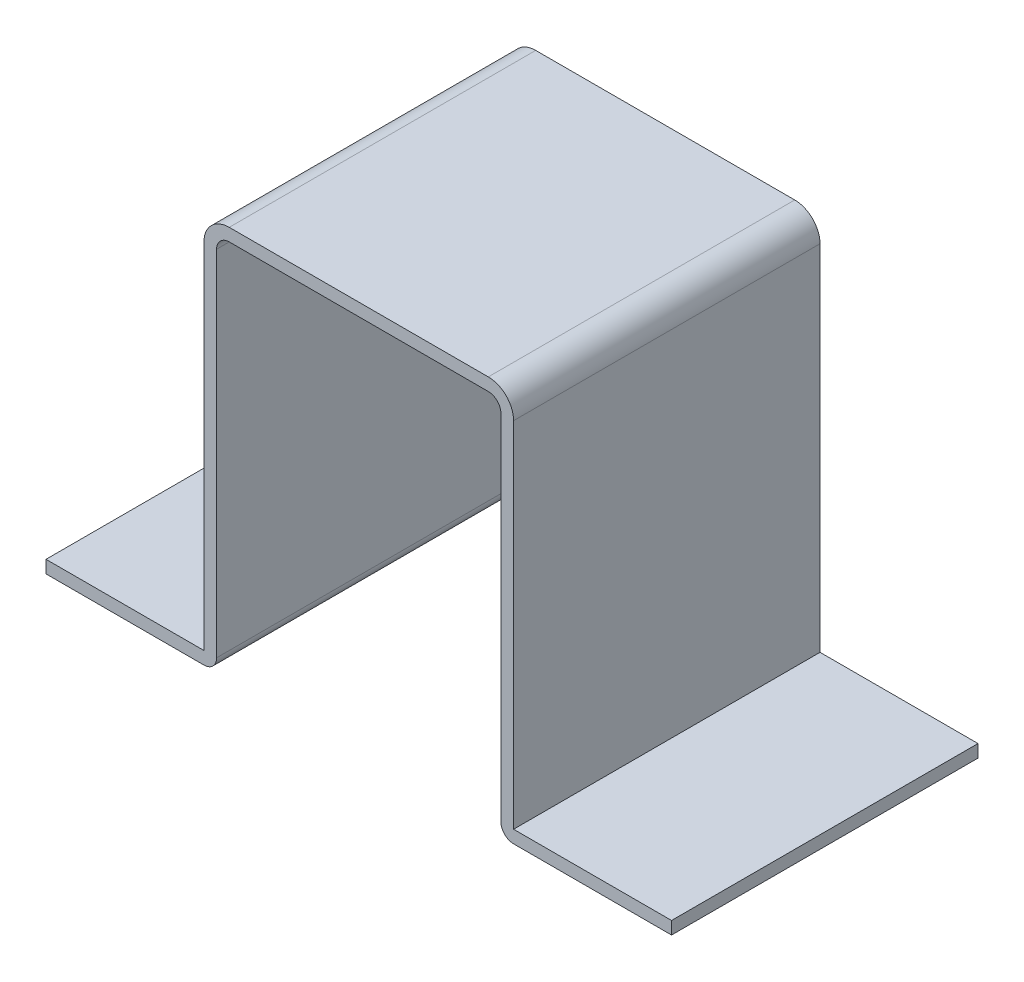
ISO-10303-21;
HEADER;
FILE_DESCRIPTION(('STEP AP214'),'2;1');
FILE_NAME('part.step','',(''),(''),'','','');
FILE_SCHEMA(('AUTOMOTIVE_DESIGN { 1 0 10303 214 1 1 1 1 }'));
ENDSEC;
DATA;
#1=APPLICATION_CONTEXT('core data for automotive mechanical design processes');
#2=APPLICATION_PROTOCOL_DEFINITION('international standard','automotive_design',2000,#1);
#3=PRODUCT_CONTEXT('',#1,'mechanical');
#4=PRODUCT('Part','Part','',(#3));
#5=PRODUCT_RELATED_PRODUCT_CATEGORY('part','',(#4));
#6=PRODUCT_DEFINITION_FORMATION('','',#4);
#7=PRODUCT_DEFINITION_CONTEXT('part definition',#1,'design');
#8=PRODUCT_DEFINITION('design','',#6,#7);
#9=PRODUCT_DEFINITION_SHAPE('','',#8);
#10=(LENGTH_UNIT() NAMED_UNIT(*) SI_UNIT(.MILLI.,.METRE.));
#11=(NAMED_UNIT(*) PLANE_ANGLE_UNIT() SI_UNIT($,.RADIAN.));
#12=(NAMED_UNIT(*) SI_UNIT($,.STERADIAN.) SOLID_ANGLE_UNIT());
#13=UNCERTAINTY_MEASURE_WITH_UNIT(LENGTH_MEASURE(1.E-05),#10,'distance_accuracy_value','');
#14=(GEOMETRIC_REPRESENTATION_CONTEXT(3) GLOBAL_UNCERTAINTY_ASSIGNED_CONTEXT((#13)) GLOBAL_UNIT_ASSIGNED_CONTEXT((#10,
#11,#12)) REPRESENTATION_CONTEXT('',''));
#15=CARTESIAN_POINT('',(0.,0.,0.));
#16=DIRECTION('',(0.,0.,1.));
#17=DIRECTION('',(1.,0.,0.));
#18=AXIS2_PLACEMENT_3D('',#15,#16,#17);
#19=CARTESIAN_POINT('',(24.5,-28.,24.25));
#20=DIRECTION('',(0.,0.,-1.));
#21=DIRECTION('',(-1.,0.,0.));
#22=AXIS2_PLACEMENT_3D('',#19,#20,#21);
#23=CYLINDRICAL_SURFACE('',#22,2.);
#24=CARTESIAN_POINT('',(24.5,-28.,-24.25));
#25=DIRECTION('',(0.,0.,1.));
#26=DIRECTION('',(-1.,0.,0.));
#27=AXIS2_PLACEMENT_3D('',#24,#25,#26);
#28=CIRCLE('',#27,2.);
#29=CARTESIAN_POINT('',(22.5,-28.,-24.25));
#30=VERTEX_POINT('',#29);
#31=CARTESIAN_POINT('',(24.5,-30.,-24.25));
#32=VERTEX_POINT('',#31);
#33=EDGE_CURVE('E190',#30,#32,#28,.T.);
#34=ORIENTED_EDGE('',*,*,#33,.T.);
#35=DIRECTION('',(0.,0.,-1.));
#36=VECTOR('',#35,1.);
#37=CARTESIAN_POINT('',(24.5,-30.,24.25));
#38=LINE('',#37,#36);
#39=CARTESIAN_POINT('',(24.5,-30.,24.25));
#40=VERTEX_POINT('',#39);
#41=EDGE_CURVE('E11',#40,#32,#38,.T.);
#42=ORIENTED_EDGE('',*,*,#41,.F.);
#43=CARTESIAN_POINT('',(24.5,-28.,24.25));
#44=DIRECTION('',(0.,0.,1.));
#45=DIRECTION('',(-1.,0.,0.));
#46=AXIS2_PLACEMENT_3D('',#43,#44,#45);
#47=CIRCLE('',#46,2.);
#48=CARTESIAN_POINT('',(22.5,-28.,24.25));
#49=VERTEX_POINT('',#48);
#50=EDGE_CURVE('E224',#49,#40,#47,.T.);
#51=ORIENTED_EDGE('',*,*,#50,.F.);
#52=DIRECTION('',(0.,0.,-1.));
#53=VECTOR('',#52,1.);
#54=CARTESIAN_POINT('',(22.5,-28.,24.25));
#55=LINE('',#54,#53);
#56=EDGE_CURVE('E186',#49,#30,#55,.T.);
#57=ORIENTED_EDGE('',*,*,#56,.T.);
#58=EDGE_LOOP('',(#34,#42,#51,#57));
#59=FACE_BOUND('',#58,.T.);
#60=ADVANCED_FACE('F34',(#59),#23,.T.);
#61=CARTESIAN_POINT('',(24.5,-30.,24.25));
#62=DIRECTION('',(0.,1.,0.));
#63=DIRECTION('',(-1.,0.,0.));
#64=AXIS2_PLACEMENT_3D('',#61,#62,#63);
#65=PLANE('',#64);
#66=DIRECTION('',(1.,0.,0.));
#67=VECTOR('',#66,1.);
#68=CARTESIAN_POINT('',(24.5,-30.,-24.25));
#69=LINE('',#68,#67);
#70=CARTESIAN_POINT('',(49.5,-30.,-24.25));
#71=VERTEX_POINT('',#70);
#72=EDGE_CURVE('E193',#32,#71,#69,.T.);
#73=ORIENTED_EDGE('',*,*,#72,.T.);
#74=DIRECTION('',(0.,0.,-1.));
#75=VECTOR('',#74,1.);
#76=CARTESIAN_POINT('',(49.5,-30.,24.25));
#77=LINE('',#76,#75);
#78=CARTESIAN_POINT('',(49.5,-30.,24.25));
#79=VERTEX_POINT('',#78);
#80=EDGE_CURVE('E42',#79,#71,#77,.T.);
#81=ORIENTED_EDGE('',*,*,#80,.F.);
#82=DIRECTION('',(1.,0.,0.));
#83=VECTOR('',#82,1.);
#84=CARTESIAN_POINT('',(24.5,-30.,24.25));
#85=LINE('',#84,#83);
#86=EDGE_CURVE('E123',#40,#79,#85,.T.);
#87=ORIENTED_EDGE('',*,*,#86,.F.);
#88=ORIENTED_EDGE('',*,*,#41,.T.);
#89=EDGE_LOOP('',(#73,#81,#87,#88));
#90=FACE_BOUND('',#89,.T.);
#91=ADVANCED_FACE('F332',(#90),#65,.F.);
#92=CARTESIAN_POINT('',(49.5,-28.,24.25));
#93=DIRECTION('',(-1.,0.,0.));
#94=DIRECTION('',(0.,0.,1.));
#95=AXIS2_PLACEMENT_3D('',#92,#93,#94);
#96=PLANE('',#95);
#97=DIRECTION('',(0.,1.,0.));
#98=VECTOR('',#97,1.);
#99=CARTESIAN_POINT('',(49.5,-28.,-24.25));
#100=LINE('',#99,#98);
#101=CARTESIAN_POINT('',(49.5,-28.,-24.25));
#102=VERTEX_POINT('',#101);
#103=EDGE_CURVE('E195',#71,#102,#100,.T.);
#104=ORIENTED_EDGE('',*,*,#103,.T.);
#105=DIRECTION('',(0.,0.,-1.));
#106=VECTOR('',#105,1.);
#107=CARTESIAN_POINT('',(49.5,-28.,24.25));
#108=LINE('',#107,#106);
#109=CARTESIAN_POINT('',(49.5,-28.,24.25));
#110=VERTEX_POINT('',#109);
#111=EDGE_CURVE('E261',#110,#102,#108,.T.);
#112=ORIENTED_EDGE('',*,*,#111,.F.);
#113=DIRECTION('',(0.,1.,0.));
#114=VECTOR('',#113,1.);
#115=CARTESIAN_POINT('',(49.5,-28.,24.25));
#116=LINE('',#115,#114);
#117=EDGE_CURVE('E269',#79,#110,#116,.T.);
#118=ORIENTED_EDGE('',*,*,#117,.F.);
#119=ORIENTED_EDGE('',*,*,#80,.T.);
#120=EDGE_LOOP('',(#104,#112,#118,#119));
#121=FACE_BOUND('',#120,.T.);
#122=ADVANCED_FACE('F267',(#121),#96,.F.);
#123=CARTESIAN_POINT('',(24.5,-28.,24.25));
#124=DIRECTION('',(0.,-1.,0.));
#125=DIRECTION('',(0.,0.,-1.));
#126=AXIS2_PLACEMENT_3D('',#123,#124,#125);
#127=PLANE('',#126);
#128=DIRECTION('',(-1.,0.,0.));
#129=VECTOR('',#128,1.);
#130=CARTESIAN_POINT('',(24.5,-28.,-24.25));
#131=LINE('',#130,#129);
#132=CARTESIAN_POINT('',(24.5,-28.,-24.25));
#133=VERTEX_POINT('',#132);
#134=EDGE_CURVE('E197',#102,#133,#131,.T.);
#135=ORIENTED_EDGE('',*,*,#134,.T.);
#136=DIRECTION('',(0.,0.,-1.));
#137=VECTOR('',#136,1.);
#138=CARTESIAN_POINT('',(24.5,-28.,24.25));
#139=LINE('',#138,#137);
#140=CARTESIAN_POINT('',(24.5,-28.,24.25));
#141=VERTEX_POINT('',#140);
#142=EDGE_CURVE('E258',#141,#133,#139,.T.);
#143=ORIENTED_EDGE('',*,*,#142,.F.);
#144=DIRECTION('',(-1.,0.,0.));
#145=VECTOR('',#144,1.);
#146=CARTESIAN_POINT('',(24.5,-28.,24.25));
#147=LINE('',#146,#145);
#148=EDGE_CURVE('E287',#110,#141,#147,.T.);
#149=ORIENTED_EDGE('',*,*,#148,.F.);
#150=ORIENTED_EDGE('',*,*,#111,.T.);
#151=EDGE_LOOP('',(#135,#143,#149,#150));
#152=FACE_BOUND('',#151,.T.);
#153=ADVANCED_FACE('F278',(#152),#127,.F.);
#154=CARTESIAN_POINT('',(24.5,-28.,24.25));
#155=DIRECTION('',(-1.,0.,0.));
#156=DIRECTION('',(0.,-1.,0.));
#157=AXIS2_PLACEMENT_3D('',#154,#155,#156);
#158=PLANE('',#157);
#159=DIRECTION('',(0.,1.,0.));
#160=VECTOR('',#159,1.);
#161=CARTESIAN_POINT('',(24.5,-28.,-24.25));
#162=LINE('',#161,#160);
#163=CARTESIAN_POINT('',(24.5,28.,-24.25));
#164=VERTEX_POINT('',#163);
#165=EDGE_CURVE('E199',#133,#164,#162,.T.);
#166=ORIENTED_EDGE('',*,*,#165,.T.);
#167=DIRECTION('',(0.,0.,-1.));
#168=VECTOR('',#167,1.);
#169=CARTESIAN_POINT('',(24.5,28.,24.25));
#170=LINE('',#169,#168);
#171=CARTESIAN_POINT('',(24.5,28.,24.25));
#172=VERTEX_POINT('',#171);
#173=EDGE_CURVE('E255',#172,#164,#170,.T.);
#174=ORIENTED_EDGE('',*,*,#173,.F.);
#175=DIRECTION('',(0.,1.,0.));
#176=VECTOR('',#175,1.);
#177=CARTESIAN_POINT('',(24.5,-28.,24.25));
#178=LINE('',#177,#176);
#179=EDGE_CURVE('E284',#141,#172,#178,.T.);
#180=ORIENTED_EDGE('',*,*,#179,.F.);
#181=ORIENTED_EDGE('',*,*,#142,.T.);
#182=EDGE_LOOP('',(#166,#174,#180,#181));
#183=FACE_BOUND('',#182,.T.);
#184=ADVANCED_FACE('F282',(#183),#158,.F.);
#185=CARTESIAN_POINT('',(20.5,28.,24.25));
#186=DIRECTION('',(0.,0.,-1.));
#187=DIRECTION('',(-1.,0.,0.));
#188=AXIS2_PLACEMENT_3D('',#185,#186,#187);
#189=CYLINDRICAL_SURFACE('',#188,4.);
#190=CARTESIAN_POINT('',(20.5,28.,-24.25));
#191=DIRECTION('',(0.,0.,1.));
#192=DIRECTION('',(1.,0.,0.));
#193=AXIS2_PLACEMENT_3D('',#190,#191,#192);
#194=CIRCLE('',#193,4.);
#195=CARTESIAN_POINT('',(20.5,32.,-24.25));
#196=VERTEX_POINT('',#195);
#197=EDGE_CURVE('E201',#164,#196,#194,.T.);
#198=ORIENTED_EDGE('',*,*,#197,.T.);
#199=DIRECTION('',(0.,0.,-1.));
#200=VECTOR('',#199,1.);
#201=CARTESIAN_POINT('',(20.5,32.,24.25));
#202=LINE('',#201,#200);
#203=CARTESIAN_POINT('',(20.5,32.,24.25));
#204=VERTEX_POINT('',#203);
#205=EDGE_CURVE('E252',#204,#196,#202,.T.);
#206=ORIENTED_EDGE('',*,*,#205,.F.);
#207=CARTESIAN_POINT('',(20.5,28.,24.25));
#208=DIRECTION('',(0.,0.,1.));
#209=DIRECTION('',(1.,0.,0.));
#210=AXIS2_PLACEMENT_3D('',#207,#208,#209);
#211=CIRCLE('',#210,4.);
#212=EDGE_CURVE('E286',#172,#204,#211,.T.);
#213=ORIENTED_EDGE('',*,*,#212,.F.);
#214=ORIENTED_EDGE('',*,*,#173,.T.);
#215=EDGE_LOOP('',(#198,#206,#213,#214));
#216=FACE_BOUND('',#215,.T.);
#217=ADVANCED_FACE('F345',(#216),#189,.T.);
#218=CARTESIAN_POINT('',(20.5,32.,24.25));
#219=DIRECTION('',(0.,-1.,0.));
#220=DIRECTION('',(0.,0.,-1.));
#221=AXIS2_PLACEMENT_3D('',#218,#219,#220);
#222=PLANE('',#221);
#223=DIRECTION('',(-1.,0.,0.));
#224=VECTOR('',#223,1.);
#225=CARTESIAN_POINT('',(20.5,32.,-24.25));
#226=LINE('',#225,#224);
#227=CARTESIAN_POINT('',(-20.5,32.,-24.25));
#228=VERTEX_POINT('',#227);
#229=EDGE_CURVE('E203',#196,#228,#226,.T.);
#230=ORIENTED_EDGE('',*,*,#229,.T.);
#231=DIRECTION('',(0.,0.,-1.));
#232=VECTOR('',#231,1.);
#233=CARTESIAN_POINT('',(-20.5,32.,24.25));
#234=LINE('',#233,#232);
#235=CARTESIAN_POINT('',(-20.5,32.,24.25));
#236=VERTEX_POINT('',#235);
#237=EDGE_CURVE('E249',#236,#228,#234,.T.);
#238=ORIENTED_EDGE('',*,*,#237,.F.);
#239=DIRECTION('',(-1.,0.,0.));
#240=VECTOR('',#239,1.);
#241=CARTESIAN_POINT('',(20.5,32.,24.25));
#242=LINE('',#241,#240);
#243=EDGE_CURVE('E289',#204,#236,#242,.T.);
#244=ORIENTED_EDGE('',*,*,#243,.F.);
#245=ORIENTED_EDGE('',*,*,#205,.T.);
#246=EDGE_LOOP('',(#230,#238,#244,#245));
#247=FACE_BOUND('',#246,.T.);
#248=ADVANCED_FACE('F348',(#247),#222,.F.);
#249=CARTESIAN_POINT('',(-20.5,28.,24.25));
#250=DIRECTION('',(0.,0.,-1.));
#251=DIRECTION('',(-1.,0.,0.));
#252=AXIS2_PLACEMENT_3D('',#249,#250,#251);
#253=CYLINDRICAL_SURFACE('',#252,4.);
#254=CARTESIAN_POINT('',(-20.5,28.,-24.25));
#255=DIRECTION('',(0.,0.,1.));
#256=DIRECTION('',(1.,0.,0.));
#257=AXIS2_PLACEMENT_3D('',#254,#255,#256);
#258=CIRCLE('',#257,4.);
#259=CARTESIAN_POINT('',(-24.5,28.,-24.25));
#260=VERTEX_POINT('',#259);
#261=EDGE_CURVE('E205',#228,#260,#258,.T.);
#262=ORIENTED_EDGE('',*,*,#261,.T.);
#263=DIRECTION('',(0.,0.,-1.));
#264=VECTOR('',#263,1.);
#265=CARTESIAN_POINT('',(-24.5,28.,24.25));
#266=LINE('',#265,#264);
#267=CARTESIAN_POINT('',(-24.5,28.,24.25));
#268=VERTEX_POINT('',#267);
#269=EDGE_CURVE('E246',#268,#260,#266,.T.);
#270=ORIENTED_EDGE('',*,*,#269,.F.);
#271=CARTESIAN_POINT('',(-20.5,28.,24.25));
#272=DIRECTION('',(0.,0.,1.));
#273=DIRECTION('',(1.,0.,0.));
#274=AXIS2_PLACEMENT_3D('',#271,#272,#273);
#275=CIRCLE('',#274,4.);
#276=EDGE_CURVE('E295',#236,#268,#275,.T.);
#277=ORIENTED_EDGE('',*,*,#276,.F.);
#278=ORIENTED_EDGE('',*,*,#237,.T.);
#279=EDGE_LOOP('',(#262,#270,#277,#278));
#280=FACE_BOUND('',#279,.T.);
#281=ADVANCED_FACE('F352',(#280),#253,.T.);
#282=CARTESIAN_POINT('',(-24.5,-28.,24.25));
#283=DIRECTION('',(1.,0.,0.));
#284=DIRECTION('',(0.,0.,-1.));
#285=AXIS2_PLACEMENT_3D('',#282,#283,#284);
#286=PLANE('',#285);
#287=DIRECTION('',(0.,-1.,0.));
#288=VECTOR('',#287,1.);
#289=CARTESIAN_POINT('',(-24.5,-28.,-24.25));
#290=LINE('',#289,#288);
#291=CARTESIAN_POINT('',(-24.5,-28.,-24.25));
#292=VERTEX_POINT('',#291);
#293=EDGE_CURVE('E207',#260,#292,#290,.T.);
#294=ORIENTED_EDGE('',*,*,#293,.T.);
#295=DIRECTION('',(0.,0.,-1.));
#296=VECTOR('',#295,1.);
#297=CARTESIAN_POINT('',(-24.5,-28.,24.25));
#298=LINE('',#297,#296);
#299=CARTESIAN_POINT('',(-24.5,-28.,24.25));
#300=VERTEX_POINT('',#299);
#301=EDGE_CURVE('E243',#300,#292,#298,.T.);
#302=ORIENTED_EDGE('',*,*,#301,.F.);
#303=DIRECTION('',(0.,-1.,0.));
#304=VECTOR('',#303,1.);
#305=CARTESIAN_POINT('',(-24.5,-28.,24.25));
#306=LINE('',#305,#304);
#307=EDGE_CURVE('E297',#268,#300,#306,.T.);
#308=ORIENTED_EDGE('',*,*,#307,.F.);
#309=ORIENTED_EDGE('',*,*,#269,.T.);
#310=EDGE_LOOP('',(#294,#302,#308,#309));
#311=FACE_BOUND('',#310,.T.);
#312=ADVANCED_FACE('F356',(#311),#286,.F.);
#313=CARTESIAN_POINT('',(-24.5,-28.,24.25));
#314=DIRECTION('',(0.,-1.,0.));
#315=DIRECTION('',(1.,0.,0.));
#316=AXIS2_PLACEMENT_3D('',#313,#314,#315);
#317=PLANE('',#316);
#318=DIRECTION('',(-1.,0.,0.));
#319=VECTOR('',#318,1.);
#320=CARTESIAN_POINT('',(-24.5,-28.,-24.25));
#321=LINE('',#320,#319);
#322=CARTESIAN_POINT('',(-49.5,-28.,-24.25));
#323=VERTEX_POINT('',#322);
#324=EDGE_CURVE('E209',#292,#323,#321,.T.);
#325=ORIENTED_EDGE('',*,*,#324,.T.);
#326=DIRECTION('',(0.,0.,-1.));
#327=VECTOR('',#326,1.);
#328=CARTESIAN_POINT('',(-49.5,-28.,24.25));
#329=LINE('',#328,#327);
#330=CARTESIAN_POINT('',(-49.5,-28.,24.25));
#331=VERTEX_POINT('',#330);
#332=EDGE_CURVE('E240',#331,#323,#329,.T.);
#333=ORIENTED_EDGE('',*,*,#332,.F.);
#334=DIRECTION('',(-1.,0.,0.));
#335=VECTOR('',#334,1.);
#336=CARTESIAN_POINT('',(-24.5,-28.,24.25));
#337=LINE('',#336,#335);
#338=EDGE_CURVE('E299',#300,#331,#337,.T.);
#339=ORIENTED_EDGE('',*,*,#338,.F.);
#340=ORIENTED_EDGE('',*,*,#301,.T.);
#341=EDGE_LOOP('',(#325,#333,#339,#340));
#342=FACE_BOUND('',#341,.T.);
#343=ADVANCED_FACE('F360',(#342),#317,.F.);
#344=CARTESIAN_POINT('',(-49.5,-28.,24.25));
#345=DIRECTION('',(1.,0.,0.));
#346=DIRECTION('',(0.,0.,-1.));
#347=AXIS2_PLACEMENT_3D('',#344,#345,#346);
#348=PLANE('',#347);
#349=DIRECTION('',(0.,-1.,0.));
#350=VECTOR('',#349,1.);
#351=CARTESIAN_POINT('',(-49.5,-28.,-24.25));
#352=LINE('',#351,#350);
#353=CARTESIAN_POINT('',(-49.5,-30.,-24.25));
#354=VERTEX_POINT('',#353);
#355=EDGE_CURVE('E211',#323,#354,#352,.T.);
#356=ORIENTED_EDGE('',*,*,#355,.T.);
#357=DIRECTION('',(0.,0.,-1.));
#358=VECTOR('',#357,1.);
#359=CARTESIAN_POINT('',(-49.5,-30.,24.25));
#360=LINE('',#359,#358);
#361=CARTESIAN_POINT('',(-49.5,-30.,24.25));
#362=VERTEX_POINT('',#361);
#363=EDGE_CURVE('E237',#362,#354,#360,.T.);
#364=ORIENTED_EDGE('',*,*,#363,.F.);
#365=DIRECTION('',(0.,-1.,0.));
#366=VECTOR('',#365,1.);
#367=CARTESIAN_POINT('',(-49.5,-28.,24.25));
#368=LINE('',#367,#366);
#369=EDGE_CURVE('E301',#331,#362,#368,.T.);
#370=ORIENTED_EDGE('',*,*,#369,.F.);
#371=ORIENTED_EDGE('',*,*,#332,.T.);
#372=EDGE_LOOP('',(#356,#364,#370,#371));
#373=FACE_BOUND('',#372,.T.);
#374=ADVANCED_FACE('F364',(#373),#348,.F.);
#375=CARTESIAN_POINT('',(-24.5,-30.,24.25));
#376=DIRECTION('',(0.,1.,0.));
#377=DIRECTION('',(-1.,0.,0.));
#378=AXIS2_PLACEMENT_3D('',#375,#376,#377);
#379=PLANE('',#378);
#380=DIRECTION('',(1.,0.,0.));
#381=VECTOR('',#380,1.);
#382=CARTESIAN_POINT('',(-24.5,-30.,-24.25));
#383=LINE('',#382,#381);
#384=CARTESIAN_POINT('',(-24.5,-30.,-24.25));
#385=VERTEX_POINT('',#384);
#386=EDGE_CURVE('E213',#354,#385,#383,.T.);
#387=ORIENTED_EDGE('',*,*,#386,.T.);
#388=DIRECTION('',(0.,0.,-1.));
#389=VECTOR('',#388,1.);
#390=CARTESIAN_POINT('',(-24.5,-30.,24.25));
#391=LINE('',#390,#389);
#392=CARTESIAN_POINT('',(-24.5,-30.,24.25));
#393=VERTEX_POINT('',#392);
#394=EDGE_CURVE('E234',#393,#385,#391,.T.);
#395=ORIENTED_EDGE('',*,*,#394,.F.);
#396=DIRECTION('',(1.,0.,0.));
#397=VECTOR('',#396,1.);
#398=CARTESIAN_POINT('',(-24.5,-30.,24.25));
#399=LINE('',#398,#397);
#400=EDGE_CURVE('E303',#362,#393,#399,.T.);
#401=ORIENTED_EDGE('',*,*,#400,.F.);
#402=ORIENTED_EDGE('',*,*,#363,.T.);
#403=EDGE_LOOP('',(#387,#395,#401,#402));
#404=FACE_BOUND('',#403,.T.);
#405=ADVANCED_FACE('F368',(#404),#379,.F.);
#406=CARTESIAN_POINT('',(-24.5,-28.,24.25));
#407=DIRECTION('',(0.,0.,-1.));
#408=DIRECTION('',(-1.,0.,0.));
#409=AXIS2_PLACEMENT_3D('',#406,#407,#408);
#410=CYLINDRICAL_SURFACE('',#409,2.);
#411=CARTESIAN_POINT('',(-24.5,-28.,-24.25));
#412=DIRECTION('',(0.,0.,1.));
#413=DIRECTION('',(1.,0.,0.));
#414=AXIS2_PLACEMENT_3D('',#411,#412,#413);
#415=CIRCLE('',#414,2.);
#416=CARTESIAN_POINT('',(-22.5,-28.,-24.25));
#417=VERTEX_POINT('',#416);
#418=EDGE_CURVE('E215',#385,#417,#415,.T.);
#419=ORIENTED_EDGE('',*,*,#418,.T.);
#420=DIRECTION('',(0.,0.,-1.));
#421=VECTOR('',#420,1.);
#422=CARTESIAN_POINT('',(-22.5,-28.,24.25));
#423=LINE('',#422,#421);
#424=CARTESIAN_POINT('',(-22.5,-28.,24.25));
#425=VERTEX_POINT('',#424);
#426=EDGE_CURVE('E231',#425,#417,#423,.T.);
#427=ORIENTED_EDGE('',*,*,#426,.F.);
#428=CARTESIAN_POINT('',(-24.5,-28.,24.25));
#429=DIRECTION('',(0.,0.,1.));
#430=DIRECTION('',(1.,0.,0.));
#431=AXIS2_PLACEMENT_3D('',#428,#429,#430);
#432=CIRCLE('',#431,2.);
#433=EDGE_CURVE('E305',#393,#425,#432,.T.);
#434=ORIENTED_EDGE('',*,*,#433,.F.);
#435=ORIENTED_EDGE('',*,*,#394,.T.);
#436=EDGE_LOOP('',(#419,#427,#434,#435));
#437=FACE_BOUND('',#436,.T.);
#438=ADVANCED_FACE('F372',(#437),#410,.T.);
#439=CARTESIAN_POINT('',(-22.5,-28.,24.25));
#440=DIRECTION('',(-1.,0.,0.));
#441=DIRECTION('',(0.,0.,1.));
#442=AXIS2_PLACEMENT_3D('',#439,#440,#441);
#443=PLANE('',#442);
#444=DIRECTION('',(0.,1.,0.));
#445=VECTOR('',#444,1.);
#446=CARTESIAN_POINT('',(-22.5,-28.,-24.25));
#447=LINE('',#446,#445);
#448=CARTESIAN_POINT('',(-22.5,28.,-24.25));
#449=VERTEX_POINT('',#448);
#450=EDGE_CURVE('E217',#417,#449,#447,.T.);
#451=ORIENTED_EDGE('',*,*,#450,.T.);
#452=DIRECTION('',(0.,0.,-1.));
#453=VECTOR('',#452,1.);
#454=CARTESIAN_POINT('',(-22.5,28.,24.25));
#455=LINE('',#454,#453);
#456=CARTESIAN_POINT('',(-22.5,28.,24.25));
#457=VERTEX_POINT('',#456);
#458=EDGE_CURVE('E228',#457,#449,#455,.T.);
#459=ORIENTED_EDGE('',*,*,#458,.F.);
#460=DIRECTION('',(0.,1.,0.));
#461=VECTOR('',#460,1.);
#462=CARTESIAN_POINT('',(-22.5,-28.,24.25));
#463=LINE('',#462,#461);
#464=EDGE_CURVE('E307',#425,#457,#463,.T.);
#465=ORIENTED_EDGE('',*,*,#464,.F.);
#466=ORIENTED_EDGE('',*,*,#426,.T.);
#467=EDGE_LOOP('',(#451,#459,#465,#466));
#468=FACE_BOUND('',#467,.T.);
#469=ADVANCED_FACE('F313',(#468),#443,.F.);
#470=CARTESIAN_POINT('',(-20.5,28.,24.25));
#471=DIRECTION('',(0.,0.,-1.));
#472=DIRECTION('',(-1.,0.,0.));
#473=AXIS2_PLACEMENT_3D('',#470,#471,#472);
#474=CYLINDRICAL_SURFACE('',#473,2.);
#475=CARTESIAN_POINT('',(-20.5,28.,-24.25));
#476=DIRECTION('',(0.,0.,-1.));
#477=DIRECTION('',(1.,0.,0.));
#478=AXIS2_PLACEMENT_3D('',#475,#476,#477);
#479=CIRCLE('',#478,2.);
#480=CARTESIAN_POINT('',(-20.5,30.,-24.25));
#481=VERTEX_POINT('',#480);
#482=EDGE_CURVE('E219',#449,#481,#479,.T.);
#483=ORIENTED_EDGE('',*,*,#482,.T.);
#484=DIRECTION('',(0.,0.,-1.));
#485=VECTOR('',#484,1.);
#486=CARTESIAN_POINT('',(-20.5,30.,24.25));
#487=LINE('',#486,#485);
#488=CARTESIAN_POINT('',(-20.5,30.,24.25));
#489=VERTEX_POINT('',#488);
#490=EDGE_CURVE('E181',#489,#481,#487,.T.);
#491=ORIENTED_EDGE('',*,*,#490,.F.);
#492=CARTESIAN_POINT('',(-20.5,28.,24.25));
#493=DIRECTION('',(0.,0.,-1.));
#494=DIRECTION('',(1.,0.,0.));
#495=AXIS2_PLACEMENT_3D('',#492,#493,#494);
#496=CIRCLE('',#495,2.);
#497=EDGE_CURVE('E172',#457,#489,#496,.T.);
#498=ORIENTED_EDGE('',*,*,#497,.F.);
#499=ORIENTED_EDGE('',*,*,#458,.T.);
#500=EDGE_LOOP('',(#483,#491,#498,#499));
#501=FACE_BOUND('',#500,.T.);
#502=ADVANCED_FACE('F317',(#501),#474,.F.);
#503=CARTESIAN_POINT('',(20.5,30.,24.25));
#504=DIRECTION('',(0.,1.,0.));
#505=DIRECTION('',(-1.,0.,0.));
#506=AXIS2_PLACEMENT_3D('',#503,#504,#505);
#507=PLANE('',#506);
#508=DIRECTION('',(1.,0.,0.));
#509=VECTOR('',#508,1.);
#510=CARTESIAN_POINT('',(20.5,30.,-24.25));
#511=LINE('',#510,#509);
#512=CARTESIAN_POINT('',(20.5,30.,-24.25));
#513=VERTEX_POINT('',#512);
#514=EDGE_CURVE('E180',#481,#513,#511,.T.);
#515=ORIENTED_EDGE('',*,*,#514,.T.);
#516=DIRECTION('',(0.,0.,-1.));
#517=VECTOR('',#516,1.);
#518=CARTESIAN_POINT('',(20.5,30.,24.25));
#519=LINE('',#518,#517);
#520=CARTESIAN_POINT('',(20.5,30.,24.25));
#521=VERTEX_POINT('',#520);
#522=EDGE_CURVE('E177',#521,#513,#519,.T.);
#523=ORIENTED_EDGE('',*,*,#522,.F.);
#524=DIRECTION('',(1.,0.,0.));
#525=VECTOR('',#524,1.);
#526=CARTESIAN_POINT('',(20.5,30.,24.25));
#527=LINE('',#526,#525);
#528=EDGE_CURVE('E166',#489,#521,#527,.T.);
#529=ORIENTED_EDGE('',*,*,#528,.F.);
#530=ORIENTED_EDGE('',*,*,#490,.T.);
#531=EDGE_LOOP('',(#515,#523,#529,#530));
#532=FACE_BOUND('',#531,.T.);
#533=ADVANCED_FACE('F178',(#532),#507,.F.);
#534=CARTESIAN_POINT('',(20.5,28.,24.25));
#535=DIRECTION('',(0.,0.,-1.));
#536=DIRECTION('',(-1.,0.,0.));
#537=AXIS2_PLACEMENT_3D('',#534,#535,#536);
#538=CYLINDRICAL_SURFACE('',#537,2.);
#539=CARTESIAN_POINT('',(20.5,28.,-24.25));
#540=DIRECTION('',(0.,0.,-1.));
#541=DIRECTION('',(1.,0.,0.));
#542=AXIS2_PLACEMENT_3D('',#539,#540,#541);
#543=CIRCLE('',#542,2.);
#544=CARTESIAN_POINT('',(22.5,28.,-24.25));
#545=VERTEX_POINT('',#544);
#546=EDGE_CURVE('E109',#513,#545,#543,.T.);
#547=ORIENTED_EDGE('',*,*,#546,.T.);
#548=DIRECTION('',(0.,0.,-1.));
#549=VECTOR('',#548,1.);
#550=CARTESIAN_POINT('',(22.5,28.,24.25));
#551=LINE('',#550,#549);
#552=CARTESIAN_POINT('',(22.5,28.,24.25));
#553=VERTEX_POINT('',#552);
#554=EDGE_CURVE('E182',#553,#545,#551,.T.);
#555=ORIENTED_EDGE('',*,*,#554,.F.);
#556=CARTESIAN_POINT('',(20.5,28.,24.25));
#557=DIRECTION('',(0.,0.,-1.));
#558=DIRECTION('',(1.,0.,0.));
#559=AXIS2_PLACEMENT_3D('',#556,#557,#558);
#560=CIRCLE('',#559,2.);
#561=EDGE_CURVE('E170',#521,#553,#560,.T.);
#562=ORIENTED_EDGE('',*,*,#561,.F.);
#563=ORIENTED_EDGE('',*,*,#522,.T.);
#564=EDGE_LOOP('',(#547,#555,#562,#563));
#565=FACE_BOUND('',#564,.T.);
#566=ADVANCED_FACE('F184',(#565),#538,.F.);
#567=CARTESIAN_POINT('',(22.5,-28.,24.25));
#568=DIRECTION('',(1.,0.,0.));
#569=DIRECTION('',(0.,0.,-1.));
#570=AXIS2_PLACEMENT_3D('',#567,#568,#569);
#571=PLANE('',#570);
#572=DIRECTION('',(0.,-1.,0.));
#573=VECTOR('',#572,1.);
#574=CARTESIAN_POINT('',(22.5,-28.,-24.25));
#575=LINE('',#574,#573);
#576=EDGE_CURVE('E115',#545,#30,#575,.T.);
#577=ORIENTED_EDGE('',*,*,#576,.T.);
#578=ORIENTED_EDGE('',*,*,#56,.F.);
#579=DIRECTION('',(0.,-1.,0.));
#580=VECTOR('',#579,1.);
#581=CARTESIAN_POINT('',(22.5,-28.,24.25));
#582=LINE('',#581,#580);
#583=EDGE_CURVE('E50',#553,#49,#582,.T.);
#584=ORIENTED_EDGE('',*,*,#583,.F.);
#585=ORIENTED_EDGE('',*,*,#554,.T.);
#586=EDGE_LOOP('',(#577,#578,#584,#585));
#587=FACE_BOUND('',#586,.T.);
#588=ADVANCED_FACE('F321',(#587),#571,.F.);
#589=CARTESIAN_POINT('',(24.5,-28.,24.25));
#590=DIRECTION('',(0.,0.,-1.));
#591=DIRECTION('',(-1.,0.,0.));
#592=AXIS2_PLACEMENT_3D('',#589,#590,#591);
#593=PLANE('',#592);
#594=ORIENTED_EDGE('',*,*,#50,.T.);
#595=ORIENTED_EDGE('',*,*,#86,.T.);
#596=ORIENTED_EDGE('',*,*,#117,.T.);
#597=ORIENTED_EDGE('',*,*,#148,.T.);
#598=ORIENTED_EDGE('',*,*,#179,.T.);
#599=ORIENTED_EDGE('',*,*,#212,.T.);
#600=ORIENTED_EDGE('',*,*,#243,.T.);
#601=ORIENTED_EDGE('',*,*,#276,.T.);
#602=ORIENTED_EDGE('',*,*,#307,.T.);
#603=ORIENTED_EDGE('',*,*,#338,.T.);
#604=ORIENTED_EDGE('',*,*,#369,.T.);
#605=ORIENTED_EDGE('',*,*,#400,.T.);
#606=ORIENTED_EDGE('',*,*,#433,.T.);
#607=ORIENTED_EDGE('',*,*,#464,.T.);
#608=ORIENTED_EDGE('',*,*,#497,.T.);
#609=ORIENTED_EDGE('',*,*,#528,.T.);
#610=ORIENTED_EDGE('',*,*,#561,.T.);
#611=ORIENTED_EDGE('',*,*,#583,.T.);
#612=EDGE_LOOP('',(#594,#595,#596,#597,#598,#599,#600,#601,#602,#603,#604,#605,#606,#607,#608,
#609,#610,#611));
#613=FACE_BOUND('',#612,.T.);
#614=ADVANCED_FACE('F168',(#613),#593,.F.);
#615=CARTESIAN_POINT('',(24.5,-28.,-24.25));
#616=DIRECTION('',(0.,0.,-1.));
#617=DIRECTION('',(-1.,0.,0.));
#618=AXIS2_PLACEMENT_3D('',#615,#616,#617);
#619=PLANE('',#618);
#620=ORIENTED_EDGE('',*,*,#33,.F.);
#621=ORIENTED_EDGE('',*,*,#576,.F.);
#622=ORIENTED_EDGE('',*,*,#546,.F.);
#623=ORIENTED_EDGE('',*,*,#514,.F.);
#624=ORIENTED_EDGE('',*,*,#482,.F.);
#625=ORIENTED_EDGE('',*,*,#450,.F.);
#626=ORIENTED_EDGE('',*,*,#418,.F.);
#627=ORIENTED_EDGE('',*,*,#386,.F.);
#628=ORIENTED_EDGE('',*,*,#355,.F.);
#629=ORIENTED_EDGE('',*,*,#324,.F.);
#630=ORIENTED_EDGE('',*,*,#293,.F.);
#631=ORIENTED_EDGE('',*,*,#261,.F.);
#632=ORIENTED_EDGE('',*,*,#229,.F.);
#633=ORIENTED_EDGE('',*,*,#197,.F.);
#634=ORIENTED_EDGE('',*,*,#165,.F.);
#635=ORIENTED_EDGE('',*,*,#134,.F.);
#636=ORIENTED_EDGE('',*,*,#103,.F.);
#637=ORIENTED_EDGE('',*,*,#72,.F.);
#638=EDGE_LOOP('',(#620,#621,#622,#623,#624,#625,#626,#627,#628,#629,#630,#631,#632,#633,#634,
#635,#636,#637));
#639=FACE_BOUND('',#638,.T.);
#640=ADVANCED_FACE('F273',(#639),#619,.T.);
#641=CLOSED_SHELL('',(#60,#91,#122,#153,#184,#217,#248,#281,#312,#343,#374,#405,#438,#469,#502,
#533,#566,#588,#614,#640));
#642=MANIFOLD_SOLID_BREP('B2',#641);
#643=ADVANCED_BREP_SHAPE_REPRESENTATION('',(#18,#642),#14);
#644=SHAPE_DEFINITION_REPRESENTATION(#9,#643);
ENDSEC;
END-ISO-10303-21;
